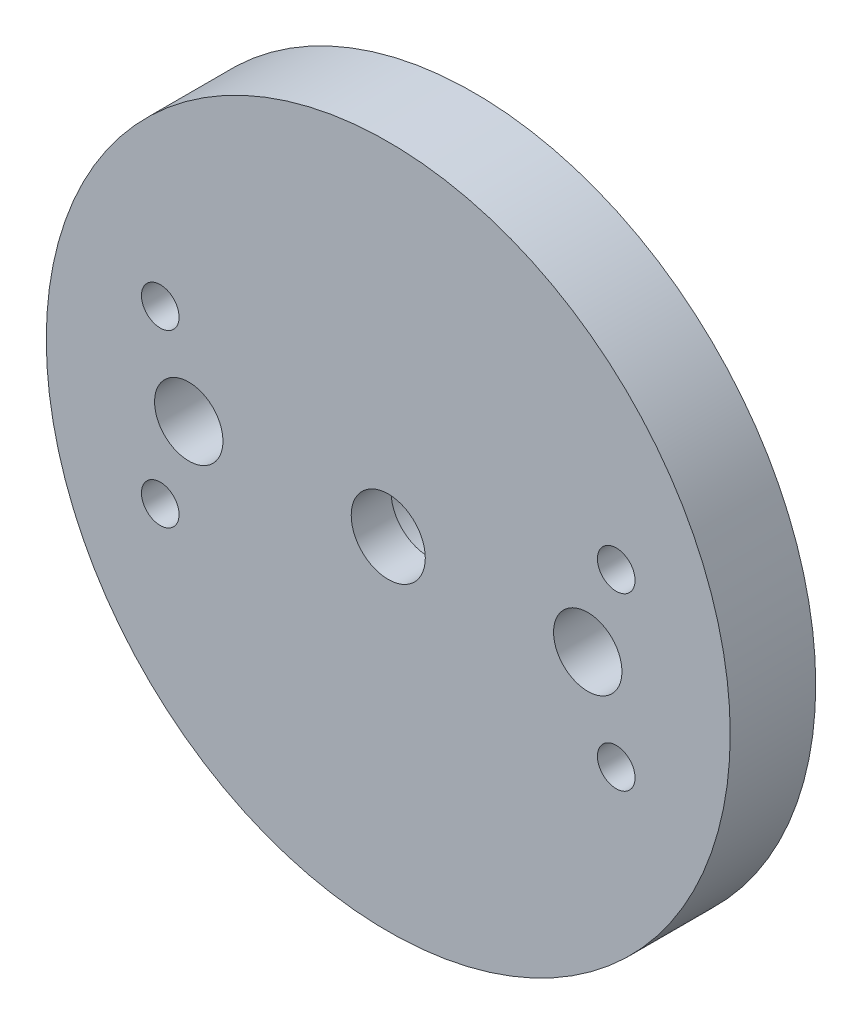
ISO-10303-21;
HEADER;
FILE_DESCRIPTION(('STEP AP214'),'2;1');
FILE_NAME('part.step','',(''),(''),'','','');
FILE_SCHEMA(('AUTOMOTIVE_DESIGN { 1 0 10303 214 1 1 1 1 }'));
ENDSEC;
DATA;
#1=APPLICATION_CONTEXT('core data for automotive mechanical design processes');
#2=APPLICATION_PROTOCOL_DEFINITION('international standard','automotive_design',2000,#1);
#3=PRODUCT_CONTEXT('',#1,'mechanical');
#4=PRODUCT('Part','Part','',(#3));
#5=PRODUCT_RELATED_PRODUCT_CATEGORY('part','',(#4));
#6=PRODUCT_DEFINITION_FORMATION('','',#4);
#7=PRODUCT_DEFINITION_CONTEXT('part definition',#1,'design');
#8=PRODUCT_DEFINITION('design','',#6,#7);
#9=PRODUCT_DEFINITION_SHAPE('','',#8);
#10=(LENGTH_UNIT() NAMED_UNIT(*) SI_UNIT(.MILLI.,.METRE.));
#11=(NAMED_UNIT(*) PLANE_ANGLE_UNIT() SI_UNIT($,.RADIAN.));
#12=(NAMED_UNIT(*) SI_UNIT($,.STERADIAN.) SOLID_ANGLE_UNIT());
#13=UNCERTAINTY_MEASURE_WITH_UNIT(LENGTH_MEASURE(1.E-05),#10,'distance_accuracy_value','');
#14=(GEOMETRIC_REPRESENTATION_CONTEXT(3) GLOBAL_UNCERTAINTY_ASSIGNED_CONTEXT((#13)) GLOBAL_UNIT_ASSIGNED_CONTEXT((#10,
#11,#12)) REPRESENTATION_CONTEXT('',''));
#15=CARTESIAN_POINT('',(0.,0.,0.));
#16=DIRECTION('',(0.,0.,1.));
#17=DIRECTION('',(1.,0.,0.));
#18=AXIS2_PLACEMENT_3D('',#15,#16,#17);
#19=CARTESIAN_POINT('',(0.,0.,15.));
#20=DIRECTION('',(0.,0.,-1.));
#21=DIRECTION('',(-1.,0.,0.));
#22=AXIS2_PLACEMENT_3D('',#19,#20,#21);
#23=CYLINDRICAL_SURFACE('',#22,60.);
#24=CARTESIAN_POINT('',(0.,0.,15.));
#25=DIRECTION('',(0.,0.,1.));
#26=DIRECTION('',(1.,0.,0.));
#27=AXIS2_PLACEMENT_3D('',#24,#25,#26);
#28=CIRCLE('',#27,60.);
#29=CARTESIAN_POINT('',(60.,0.,15.));
#30=VERTEX_POINT('',#29);
#31=EDGE_CURVE('E10',#30,#30,#28,.T.);
#32=ORIENTED_EDGE('',*,*,#31,.F.);
#33=EDGE_LOOP('',(#32));
#34=FACE_BOUND('',#33,.T.);
#35=CARTESIAN_POINT('',(0.,0.,0.));
#36=DIRECTION('',(0.,0.,1.));
#37=DIRECTION('',(1.,0.,0.));
#38=AXIS2_PLACEMENT_3D('',#35,#36,#37);
#39=CIRCLE('',#38,60.);
#40=CARTESIAN_POINT('',(60.,0.,0.));
#41=VERTEX_POINT('',#40);
#42=EDGE_CURVE('E35',#41,#41,#39,.T.);
#43=ORIENTED_EDGE('',*,*,#42,.T.);
#44=EDGE_LOOP('',(#43));
#45=FACE_BOUND('',#44,.T.);
#46=ADVANCED_FACE('F32',(#34,#45),#23,.T.);
#47=CARTESIAN_POINT('',(0.,0.,15.));
#48=DIRECTION('',(0.,0.,1.));
#49=DIRECTION('',(1.,0.,0.));
#50=AXIS2_PLACEMENT_3D('',#47,#48,#49);
#51=PLANE('',#50);
#52=CARTESIAN_POINT('',(-40.,15.,15.));
#53=DIRECTION('',(0.,0.,1.));
#54=DIRECTION('',(1.,0.,0.));
#55=AXIS2_PLACEMENT_3D('',#52,#53,#54);
#56=CIRCLE('',#55,3.3);
#57=CARTESIAN_POINT('',(-36.7,15.,15.));
#58=VERTEX_POINT('',#57);
#59=EDGE_CURVE('E74',#58,#58,#56,.T.);
#60=ORIENTED_EDGE('',*,*,#59,.F.);
#61=EDGE_LOOP('',(#60));
#62=FACE_BOUND('',#61,.T.);
#63=CARTESIAN_POINT('',(-40.,-15.,15.));
#64=DIRECTION('',(0.,0.,1.));
#65=DIRECTION('',(1.,0.,0.));
#66=AXIS2_PLACEMENT_3D('',#63,#64,#65);
#67=CIRCLE('',#66,3.3);
#68=CARTESIAN_POINT('',(-36.7,-15.,15.));
#69=VERTEX_POINT('',#68);
#70=EDGE_CURVE('E80',#69,#69,#67,.T.);
#71=ORIENTED_EDGE('',*,*,#70,.F.);
#72=EDGE_LOOP('',(#71));
#73=FACE_BOUND('',#72,.T.);
#74=CARTESIAN_POINT('',(40.,-15.,15.));
#75=DIRECTION('',(0.,0.,1.));
#76=DIRECTION('',(1.,0.,0.));
#77=AXIS2_PLACEMENT_3D('',#74,#75,#76);
#78=CIRCLE('',#77,3.3);
#79=CARTESIAN_POINT('',(43.3,-15.,15.));
#80=VERTEX_POINT('',#79);
#81=EDGE_CURVE('E86',#80,#80,#78,.T.);
#82=ORIENTED_EDGE('',*,*,#81,.F.);
#83=EDGE_LOOP('',(#82));
#84=FACE_BOUND('',#83,.T.);
#85=CARTESIAN_POINT('',(40.,15.,15.));
#86=DIRECTION('',(0.,0.,1.));
#87=DIRECTION('',(1.,0.,0.));
#88=AXIS2_PLACEMENT_3D('',#85,#86,#87);
#89=CIRCLE('',#88,3.3);
#90=CARTESIAN_POINT('',(43.3,15.,15.));
#91=VERTEX_POINT('',#90);
#92=EDGE_CURVE('E68',#91,#91,#89,.T.);
#93=ORIENTED_EDGE('',*,*,#92,.F.);
#94=EDGE_LOOP('',(#93));
#95=FACE_BOUND('',#94,.T.);
#96=CARTESIAN_POINT('',(0.,0.,15.));
#97=DIRECTION('',(0.,0.,1.));
#98=DIRECTION('',(1.,0.,0.));
#99=AXIS2_PLACEMENT_3D('',#96,#97,#98);
#100=CIRCLE('',#99,6.5);
#101=CARTESIAN_POINT('',(6.5,0.,15.));
#102=VERTEX_POINT('',#101);
#103=EDGE_CURVE('E59',#102,#102,#100,.T.);
#104=ORIENTED_EDGE('',*,*,#103,.F.);
#105=EDGE_LOOP('',(#104));
#106=FACE_BOUND('',#105,.T.);
#107=CARTESIAN_POINT('',(-35.,0.,15.));
#108=DIRECTION('',(0.,0.,-1.));
#109=DIRECTION('',(-1.,0.,0.));
#110=AXIS2_PLACEMENT_3D('',#107,#108,#109);
#111=CIRCLE('',#110,5.99999999999999);
#112=CARTESIAN_POINT('',(-41.,0.,15.));
#113=VERTEX_POINT('',#112);
#114=EDGE_CURVE('E47',#113,#113,#111,.T.);
#115=ORIENTED_EDGE('',*,*,#114,.T.);
#116=EDGE_LOOP('',(#115));
#117=FACE_BOUND('',#116,.T.);
#118=CARTESIAN_POINT('',(35.,0.,15.));
#119=DIRECTION('',(0.,0.,-1.));
#120=DIRECTION('',(-1.,0.,0.));
#121=AXIS2_PLACEMENT_3D('',#118,#119,#120);
#122=CIRCLE('',#121,6.);
#123=CARTESIAN_POINT('',(29.,0.,15.));
#124=VERTEX_POINT('',#123);
#125=EDGE_CURVE('E42',#124,#124,#122,.T.);
#126=ORIENTED_EDGE('',*,*,#125,.T.);
#127=EDGE_LOOP('',(#126));
#128=FACE_BOUND('',#127,.T.);
#129=ORIENTED_EDGE('',*,*,#31,.T.);
#130=EDGE_LOOP('',(#129));
#131=FACE_BOUND('',#130,.T.);
#132=ADVANCED_FACE('F101',(#62,#73,#84,#95,#106,#117,#128,#131),#51,.T.);
#133=CARTESIAN_POINT('',(0.,0.,0.));
#134=DIRECTION('',(0.,0.,1.));
#135=DIRECTION('',(1.,0.,0.));
#136=AXIS2_PLACEMENT_3D('',#133,#134,#135);
#137=PLANE('',#136);
#138=CARTESIAN_POINT('',(0.,0.,0.));
#139=DIRECTION('',(0.,0.,-1.));
#140=DIRECTION('',(-1.,0.,0.));
#141=AXIS2_PLACEMENT_3D('',#138,#139,#140);
#142=CIRCLE('',#141,11.);
#143=CARTESIAN_POINT('',(-11.,0.,0.));
#144=VERTEX_POINT('',#143);
#145=EDGE_CURVE('E56',#144,#144,#142,.T.);
#146=ORIENTED_EDGE('',*,*,#145,.F.);
#147=EDGE_LOOP('',(#146));
#148=FACE_BOUND('',#147,.T.);
#149=CARTESIAN_POINT('',(-35.,0.,0.));
#150=DIRECTION('',(0.,0.,-1.));
#151=DIRECTION('',(-1.,0.,0.));
#152=AXIS2_PLACEMENT_3D('',#149,#150,#151);
#153=CIRCLE('',#152,5.99999999999999);
#154=CARTESIAN_POINT('',(-41.,0.,0.));
#155=VERTEX_POINT('',#154);
#156=EDGE_CURVE('E50',#155,#155,#153,.T.);
#157=ORIENTED_EDGE('',*,*,#156,.F.);
#158=EDGE_LOOP('',(#157));
#159=FACE_BOUND('',#158,.T.);
#160=CARTESIAN_POINT('',(35.,0.,0.));
#161=DIRECTION('',(0.,0.,-1.));
#162=DIRECTION('',(-1.,0.,0.));
#163=AXIS2_PLACEMENT_3D('',#160,#161,#162);
#164=CIRCLE('',#163,6.);
#165=CARTESIAN_POINT('',(29.,0.,0.));
#166=VERTEX_POINT('',#165);
#167=EDGE_CURVE('E44',#166,#166,#164,.T.);
#168=ORIENTED_EDGE('',*,*,#167,.F.);
#169=EDGE_LOOP('',(#168));
#170=FACE_BOUND('',#169,.T.);
#171=ORIENTED_EDGE('',*,*,#42,.F.);
#172=EDGE_LOOP('',(#171));
#173=FACE_BOUND('',#172,.T.);
#174=ADVANCED_FACE('F104',(#148,#159,#170,#173),#137,.F.);
#175=CARTESIAN_POINT('',(35.,0.,15.));
#176=DIRECTION('',(0.,0.,-1.));
#177=DIRECTION('',(-1.,0.,0.));
#178=AXIS2_PLACEMENT_3D('',#175,#176,#177);
#179=CYLINDRICAL_SURFACE('',#178,6.);
#180=ORIENTED_EDGE('',*,*,#125,.F.);
#181=EDGE_LOOP('',(#180));
#182=FACE_BOUND('',#181,.T.);
#183=ORIENTED_EDGE('',*,*,#167,.T.);
#184=EDGE_LOOP('',(#183));
#185=FACE_BOUND('',#184,.T.);
#186=ADVANCED_FACE('F115',(#182,#185),#179,.F.);
#187=CARTESIAN_POINT('',(-35.,0.,15.));
#188=DIRECTION('',(0.,0.,-1.));
#189=DIRECTION('',(-1.,0.,0.));
#190=AXIS2_PLACEMENT_3D('',#187,#188,#189);
#191=CYLINDRICAL_SURFACE('',#190,5.99999999999999);
#192=ORIENTED_EDGE('',*,*,#114,.F.);
#193=EDGE_LOOP('',(#192));
#194=FACE_BOUND('',#193,.T.);
#195=ORIENTED_EDGE('',*,*,#156,.T.);
#196=EDGE_LOOP('',(#195));
#197=FACE_BOUND('',#196,.T.);
#198=ADVANCED_FACE('F118',(#194,#197),#191,.F.);
#199=CARTESIAN_POINT('',(0.,0.,8.));
#200=DIRECTION('',(0.,0.,-1.));
#201=DIRECTION('',(-1.,0.,0.));
#202=AXIS2_PLACEMENT_3D('',#199,#200,#201);
#203=CYLINDRICAL_SURFACE('',#202,11.);
#204=CARTESIAN_POINT('',(0.,0.,8.));
#205=DIRECTION('',(0.,0.,-1.));
#206=DIRECTION('',(-1.,0.,0.));
#207=AXIS2_PLACEMENT_3D('',#204,#205,#206);
#208=CIRCLE('',#207,11.);
#209=CARTESIAN_POINT('',(-11.,0.,8.));
#210=VERTEX_POINT('',#209);
#211=EDGE_CURVE('E53',#210,#210,#208,.T.);
#212=ORIENTED_EDGE('',*,*,#211,.F.);
#213=EDGE_LOOP('',(#212));
#214=FACE_BOUND('',#213,.T.);
#215=ORIENTED_EDGE('',*,*,#145,.T.);
#216=EDGE_LOOP('',(#215));
#217=FACE_BOUND('',#216,.T.);
#218=ADVANCED_FACE('F152',(#214,#217),#203,.F.);
#219=CARTESIAN_POINT('',(0.,0.,8.));
#220=DIRECTION('',(0.,0.,-1.));
#221=DIRECTION('',(-1.,0.,0.));
#222=AXIS2_PLACEMENT_3D('',#219,#220,#221);
#223=PLANE('',#222);
#224=CARTESIAN_POINT('',(0.,0.,8.));
#225=DIRECTION('',(0.,0.,-1.));
#226=DIRECTION('',(-1.,0.,0.));
#227=AXIS2_PLACEMENT_3D('',#224,#225,#226);
#228=CIRCLE('',#227,6.5);
#229=CARTESIAN_POINT('',(-6.5,0.,8.));
#230=VERTEX_POINT('',#229);
#231=EDGE_CURVE('E64',#230,#230,#228,.T.);
#232=ORIENTED_EDGE('',*,*,#231,.F.);
#233=EDGE_LOOP('',(#232));
#234=FACE_BOUND('',#233,.T.);
#235=ORIENTED_EDGE('',*,*,#211,.T.);
#236=EDGE_LOOP('',(#235));
#237=FACE_BOUND('',#236,.T.);
#238=ADVANCED_FACE('F159',(#234,#237),#223,.T.);
#239=CARTESIAN_POINT('',(0.,0.,18.));
#240=DIRECTION('',(0.,0.,-1.));
#241=DIRECTION('',(-1.,0.,0.));
#242=AXIS2_PLACEMENT_3D('',#239,#240,#241);
#243=CYLINDRICAL_SURFACE('',#242,6.5);
#244=ORIENTED_EDGE('',*,*,#103,.T.);
#245=EDGE_LOOP('',(#244));
#246=FACE_BOUND('',#245,.T.);
#247=ORIENTED_EDGE('',*,*,#231,.T.);
#248=EDGE_LOOP('',(#247));
#249=FACE_BOUND('',#248,.T.);
#250=ADVANCED_FACE('F167',(#246,#249),#243,.F.);
#251=CARTESIAN_POINT('',(40.,15.,5.));
#252=DIRECTION('',(0.,0.,1.));
#253=DIRECTION('',(1.,0.,0.));
#254=AXIS2_PLACEMENT_3D('',#251,#252,#253);
#255=CYLINDRICAL_SURFACE('',#254,3.3);
#256=CARTESIAN_POINT('',(40.,15.,5.));
#257=DIRECTION('',(0.,0.,1.));
#258=DIRECTION('',(1.,0.,0.));
#259=AXIS2_PLACEMENT_3D('',#256,#257,#258);
#260=CIRCLE('',#259,3.3);
#261=CARTESIAN_POINT('',(43.3,15.,5.));
#262=VERTEX_POINT('',#261);
#263=EDGE_CURVE('E67',#262,#262,#260,.T.);
#264=ORIENTED_EDGE('',*,*,#263,.F.);
#265=EDGE_LOOP('',(#264));
#266=FACE_BOUND('',#265,.T.);
#267=ORIENTED_EDGE('',*,*,#92,.T.);
#268=EDGE_LOOP('',(#267));
#269=FACE_BOUND('',#268,.T.);
#270=ADVANCED_FACE('F174',(#266,#269),#255,.F.);
#271=CARTESIAN_POINT('',(40.,15.,5.));
#272=DIRECTION('',(0.,0.,1.));
#273=DIRECTION('',(1.,0.,0.));
#274=AXIS2_PLACEMENT_3D('',#271,#272,#273);
#275=PLANE('',#274);
#276=ORIENTED_EDGE('',*,*,#263,.T.);
#277=EDGE_LOOP('',(#276));
#278=FACE_BOUND('',#277,.T.);
#279=ADVANCED_FACE('F97',(#278),#275,.T.);
#280=CARTESIAN_POINT('',(40.,-15.,5.));
#281=DIRECTION('',(0.,0.,1.));
#282=DIRECTION('',(1.,0.,0.));
#283=AXIS2_PLACEMENT_3D('',#280,#281,#282);
#284=CYLINDRICAL_SURFACE('',#283,3.3);
#285=CARTESIAN_POINT('',(40.,-15.,5.));
#286=DIRECTION('',(0.,0.,1.));
#287=DIRECTION('',(1.,0.,0.));
#288=AXIS2_PLACEMENT_3D('',#285,#286,#287);
#289=CIRCLE('',#288,3.3);
#290=CARTESIAN_POINT('',(43.3,-15.,5.));
#291=VERTEX_POINT('',#290);
#292=EDGE_CURVE('E71',#291,#291,#289,.T.);
#293=ORIENTED_EDGE('',*,*,#292,.F.);
#294=EDGE_LOOP('',(#293));
#295=FACE_BOUND('',#294,.T.);
#296=ORIENTED_EDGE('',*,*,#81,.T.);
#297=EDGE_LOOP('',(#296));
#298=FACE_BOUND('',#297,.T.);
#299=ADVANCED_FACE('F94',(#295,#298),#284,.F.);
#300=CARTESIAN_POINT('',(40.,-15.,5.));
#301=DIRECTION('',(0.,0.,1.));
#302=DIRECTION('',(1.,0.,0.));
#303=AXIS2_PLACEMENT_3D('',#300,#301,#302);
#304=PLANE('',#303);
#305=ORIENTED_EDGE('',*,*,#292,.T.);
#306=EDGE_LOOP('',(#305));
#307=FACE_BOUND('',#306,.T.);
#308=ADVANCED_FACE('F92',(#307),#304,.T.);
#309=CARTESIAN_POINT('',(-40.,-15.,5.));
#310=DIRECTION('',(0.,0.,1.));
#311=DIRECTION('',(1.,0.,0.));
#312=AXIS2_PLACEMENT_3D('',#309,#310,#311);
#313=CYLINDRICAL_SURFACE('',#312,3.3);
#314=CARTESIAN_POINT('',(-40.,-15.,5.));
#315=DIRECTION('',(0.,0.,1.));
#316=DIRECTION('',(1.,0.,0.));
#317=AXIS2_PLACEMENT_3D('',#314,#315,#316);
#318=CIRCLE('',#317,3.3);
#319=CARTESIAN_POINT('',(-36.7,-15.,5.));
#320=VERTEX_POINT('',#319);
#321=EDGE_CURVE('E83',#320,#320,#318,.T.);
#322=ORIENTED_EDGE('',*,*,#321,.F.);
#323=EDGE_LOOP('',(#322));
#324=FACE_BOUND('',#323,.T.);
#325=ORIENTED_EDGE('',*,*,#70,.T.);
#326=EDGE_LOOP('',(#325));
#327=FACE_BOUND('',#326,.T.);
#328=ADVANCED_FACE('F199',(#324,#327),#313,.F.);
#329=CARTESIAN_POINT('',(-40.,-15.,5.));
#330=DIRECTION('',(0.,0.,1.));
#331=DIRECTION('',(1.,0.,0.));
#332=AXIS2_PLACEMENT_3D('',#329,#330,#331);
#333=PLANE('',#332);
#334=ORIENTED_EDGE('',*,*,#321,.T.);
#335=EDGE_LOOP('',(#334));
#336=FACE_BOUND('',#335,.T.);
#337=ADVANCED_FACE('F206',(#336),#333,.T.);
#338=CARTESIAN_POINT('',(-40.,15.,5.));
#339=DIRECTION('',(0.,0.,1.));
#340=DIRECTION('',(1.,0.,0.));
#341=AXIS2_PLACEMENT_3D('',#338,#339,#340);
#342=CYLINDRICAL_SURFACE('',#341,3.3);
#343=CARTESIAN_POINT('',(-40.,15.,5.));
#344=DIRECTION('',(0.,0.,1.));
#345=DIRECTION('',(1.,0.,0.));
#346=AXIS2_PLACEMENT_3D('',#343,#344,#345);
#347=CIRCLE('',#346,3.3);
#348=CARTESIAN_POINT('',(-36.7,15.,5.));
#349=VERTEX_POINT('',#348);
#350=EDGE_CURVE('E77',#349,#349,#347,.T.);
#351=ORIENTED_EDGE('',*,*,#350,.F.);
#352=EDGE_LOOP('',(#351));
#353=FACE_BOUND('',#352,.T.);
#354=ORIENTED_EDGE('',*,*,#59,.T.);
#355=EDGE_LOOP('',(#354));
#356=FACE_BOUND('',#355,.T.);
#357=ADVANCED_FACE('F214',(#353,#356),#342,.F.);
#358=CARTESIAN_POINT('',(-40.,15.,5.));
#359=DIRECTION('',(0.,0.,1.));
#360=DIRECTION('',(1.,0.,0.));
#361=AXIS2_PLACEMENT_3D('',#358,#359,#360);
#362=PLANE('',#361);
#363=ORIENTED_EDGE('',*,*,#350,.T.);
#364=EDGE_LOOP('',(#363));
#365=FACE_BOUND('',#364,.T.);
#366=ADVANCED_FACE('F222',(#365),#362,.T.);
#367=CLOSED_SHELL('',(#46,#132,#174,#186,#198,#218,#238,#250,#270,#279,#299,#308,#328,#337,#357,#366));
#368=MANIFOLD_SOLID_BREP('B2',#367);
#369=ADVANCED_BREP_SHAPE_REPRESENTATION('',(#18,#368),#14);
#370=SHAPE_DEFINITION_REPRESENTATION(#9,#369);
ENDSEC;
END-ISO-10303-21;
